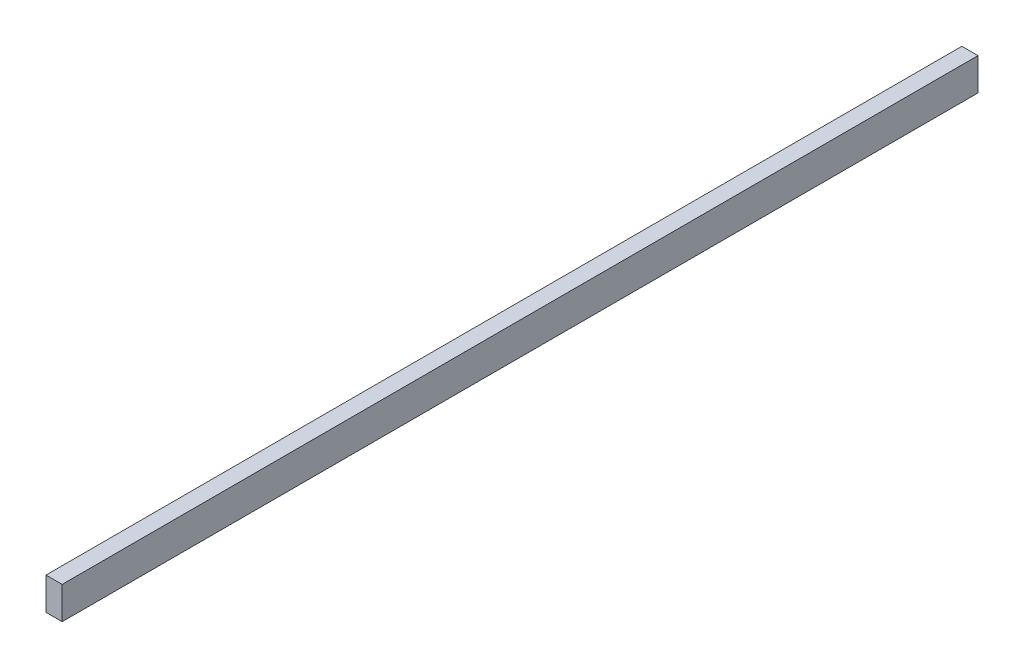
ISO-10303-21;
HEADER;
FILE_DESCRIPTION(('STEP AP214'),'2;1');
FILE_NAME('part.step','',(''),(''),'','','');
FILE_SCHEMA(('AUTOMOTIVE_DESIGN { 1 0 10303 214 1 1 1 1 }'));
ENDSEC;
DATA;
#1=APPLICATION_CONTEXT('core data for automotive mechanical design processes');
#2=APPLICATION_PROTOCOL_DEFINITION('international standard','automotive_design',2000,#1);
#3=PRODUCT_CONTEXT('',#1,'mechanical');
#4=PRODUCT('Part','Part','',(#3));
#5=PRODUCT_RELATED_PRODUCT_CATEGORY('part','',(#4));
#6=PRODUCT_DEFINITION_FORMATION('','',#4);
#7=PRODUCT_DEFINITION_CONTEXT('part definition',#1,'design');
#8=PRODUCT_DEFINITION('design','',#6,#7);
#9=PRODUCT_DEFINITION_SHAPE('','',#8);
#10=(LENGTH_UNIT() NAMED_UNIT(*) SI_UNIT(.MILLI.,.METRE.));
#11=(NAMED_UNIT(*) PLANE_ANGLE_UNIT() SI_UNIT($,.RADIAN.));
#12=(NAMED_UNIT(*) SI_UNIT($,.STERADIAN.) SOLID_ANGLE_UNIT());
#13=UNCERTAINTY_MEASURE_WITH_UNIT(LENGTH_MEASURE(1.E-05),#10,'distance_accuracy_value','');
#14=(GEOMETRIC_REPRESENTATION_CONTEXT(3) GLOBAL_UNCERTAINTY_ASSIGNED_CONTEXT((#13)) GLOBAL_UNIT_ASSIGNED_CONTEXT((#10,
#11,#12)) REPRESENTATION_CONTEXT('',''));
#15=CARTESIAN_POINT('',(0.,0.,0.));
#16=DIRECTION('',(0.,0.,1.));
#17=DIRECTION('',(1.,0.,0.));
#18=AXIS2_PLACEMENT_3D('',#15,#16,#17);
#19=CARTESIAN_POINT('',(0.75000000000001,3.,42.5));
#20=DIRECTION('',(-1.,0.,0.));
#21=DIRECTION('',(0.,0.,1.));
#22=AXIS2_PLACEMENT_3D('',#19,#20,#21);
#23=PLANE('',#22);
#24=DIRECTION('',(0.,0.,-1.));
#25=VECTOR('',#24,1.);
#26=CARTESIAN_POINT('',(0.75000000000001,0.,42.5));
#27=LINE('',#26,#25);
#28=CARTESIAN_POINT('',(0.75000000000001,0.,42.5));
#29=VERTEX_POINT('',#28);
#30=CARTESIAN_POINT('',(0.75000000000001,0.,-42.5));
#31=VERTEX_POINT('',#30);
#32=EDGE_CURVE('E98',#29,#31,#27,.T.);
#33=ORIENTED_EDGE('',*,*,#32,.T.);
#34=DIRECTION('',(0.,-1.,0.));
#35=VECTOR('',#34,1.);
#36=CARTESIAN_POINT('',(0.75000000000001,3.,-42.5));
#37=LINE('',#36,#35);
#38=CARTESIAN_POINT('',(0.75000000000001,3.,-42.5));
#39=VERTEX_POINT('',#38);
#40=EDGE_CURVE('E11',#39,#31,#37,.T.);
#41=ORIENTED_EDGE('',*,*,#40,.F.);
#42=DIRECTION('',(0.,0.,-1.));
#43=VECTOR('',#42,1.);
#44=CARTESIAN_POINT('',(0.75000000000001,3.,42.5));
#45=LINE('',#44,#43);
#46=CARTESIAN_POINT('',(0.75000000000001,3.,42.5));
#47=VERTEX_POINT('',#46);
#48=EDGE_CURVE('E86',#47,#39,#45,.T.);
#49=ORIENTED_EDGE('',*,*,#48,.F.);
#50=DIRECTION('',(0.,-1.,0.));
#51=VECTOR('',#50,1.);
#52=CARTESIAN_POINT('',(0.75000000000001,3.,42.5));
#53=LINE('',#52,#51);
#54=EDGE_CURVE('E94',#47,#29,#53,.T.);
#55=ORIENTED_EDGE('',*,*,#54,.T.);
#56=EDGE_LOOP('',(#33,#41,#49,#55));
#57=FACE_BOUND('',#56,.T.);
#58=ADVANCED_FACE('F35',(#57),#23,.F.);
#59=CARTESIAN_POINT('',(-0.75000000000001,3.,-42.5));
#60=DIRECTION('',(0.,0.,1.));
#61=DIRECTION('',(1.,0.,0.));
#62=AXIS2_PLACEMENT_3D('',#59,#60,#61);
#63=PLANE('',#62);
#64=DIRECTION('',(-1.,0.,0.));
#65=VECTOR('',#64,1.);
#66=CARTESIAN_POINT('',(-0.75000000000001,0.,-42.5));
#67=LINE('',#66,#65);
#68=CARTESIAN_POINT('',(-0.75000000000001,0.,-42.5));
#69=VERTEX_POINT('',#68);
#70=EDGE_CURVE('E90',#31,#69,#67,.T.);
#71=ORIENTED_EDGE('',*,*,#70,.T.);
#72=DIRECTION('',(0.,-1.,0.));
#73=VECTOR('',#72,1.);
#74=CARTESIAN_POINT('',(-0.75000000000001,3.,-42.5));
#75=LINE('',#74,#73);
#76=CARTESIAN_POINT('',(-0.75000000000001,3.,-42.5));
#77=VERTEX_POINT('',#76);
#78=EDGE_CURVE('E43',#77,#69,#75,.T.);
#79=ORIENTED_EDGE('',*,*,#78,.F.);
#80=DIRECTION('',(-1.,0.,0.));
#81=VECTOR('',#80,1.);
#82=CARTESIAN_POINT('',(-0.75000000000001,3.,-42.5));
#83=LINE('',#82,#81);
#84=EDGE_CURVE('E81',#39,#77,#83,.T.);
#85=ORIENTED_EDGE('',*,*,#84,.F.);
#86=ORIENTED_EDGE('',*,*,#40,.T.);
#87=EDGE_LOOP('',(#71,#79,#85,#86));
#88=FACE_BOUND('',#87,.T.);
#89=ADVANCED_FACE('F89',(#88),#63,.F.);
#90=CARTESIAN_POINT('',(-0.74999999999999,3.,42.5));
#91=DIRECTION('',(1.,0.,0.));
#92=DIRECTION('',(0.,0.,-1.));
#93=AXIS2_PLACEMENT_3D('',#90,#91,#92);
#94=PLANE('',#93);
#95=DIRECTION('',(0.,0.,1.));
#96=VECTOR('',#95,1.);
#97=CARTESIAN_POINT('',(-0.74999999999999,0.,42.5));
#98=LINE('',#97,#96);
#99=CARTESIAN_POINT('',(-0.74999999999999,0.,42.5));
#100=VERTEX_POINT('',#99);
#101=EDGE_CURVE('E68',#69,#100,#98,.T.);
#102=ORIENTED_EDGE('',*,*,#101,.T.);
#103=DIRECTION('',(0.,-1.,0.));
#104=VECTOR('',#103,1.);
#105=CARTESIAN_POINT('',(-0.74999999999999,3.,42.5));
#106=LINE('',#105,#104);
#107=CARTESIAN_POINT('',(-0.74999999999999,3.,42.5));
#108=VERTEX_POINT('',#107);
#109=EDGE_CURVE('E91',#108,#100,#106,.T.);
#110=ORIENTED_EDGE('',*,*,#109,.F.);
#111=DIRECTION('',(0.,0.,1.));
#112=VECTOR('',#111,1.);
#113=CARTESIAN_POINT('',(-0.74999999999999,3.,42.5));
#114=LINE('',#113,#112);
#115=EDGE_CURVE('E84',#77,#108,#114,.T.);
#116=ORIENTED_EDGE('',*,*,#115,.F.);
#117=ORIENTED_EDGE('',*,*,#78,.T.);
#118=EDGE_LOOP('',(#102,#110,#116,#117));
#119=FACE_BOUND('',#118,.T.);
#120=ADVANCED_FACE('F92',(#119),#94,.F.);
#121=CARTESIAN_POINT('',(-0.74999999999999,3.,42.5));
#122=DIRECTION('',(0.,0.,-1.));
#123=DIRECTION('',(-1.,0.,0.));
#124=AXIS2_PLACEMENT_3D('',#121,#122,#123);
#125=PLANE('',#124);
#126=DIRECTION('',(1.,0.,0.));
#127=VECTOR('',#126,1.);
#128=CARTESIAN_POINT('',(-0.74999999999999,0.,42.5));
#129=LINE('',#128,#127);
#130=EDGE_CURVE('E74',#100,#29,#129,.T.);
#131=ORIENTED_EDGE('',*,*,#130,.T.);
#132=ORIENTED_EDGE('',*,*,#54,.F.);
#133=DIRECTION('',(1.,0.,0.));
#134=VECTOR('',#133,1.);
#135=CARTESIAN_POINT('',(-0.74999999999999,3.,42.5));
#136=LINE('',#135,#134);
#137=EDGE_CURVE('E51',#108,#47,#136,.T.);
#138=ORIENTED_EDGE('',*,*,#137,.F.);
#139=ORIENTED_EDGE('',*,*,#109,.T.);
#140=EDGE_LOOP('',(#131,#132,#138,#139));
#141=FACE_BOUND('',#140,.T.);
#142=ADVANCED_FACE('F105',(#141),#125,.F.);
#143=CARTESIAN_POINT('',(0.,3.,0.));
#144=DIRECTION('',(0.,-1.,0.));
#145=DIRECTION('',(0.,0.,-1.));
#146=AXIS2_PLACEMENT_3D('',#143,#144,#145);
#147=PLANE('',#146);
#148=ORIENTED_EDGE('',*,*,#48,.T.);
#149=ORIENTED_EDGE('',*,*,#84,.T.);
#150=ORIENTED_EDGE('',*,*,#115,.T.);
#151=ORIENTED_EDGE('',*,*,#137,.T.);
#152=EDGE_LOOP('',(#148,#149,#150,#151));
#153=FACE_BOUND('',#152,.T.);
#154=ADVANCED_FACE('F82',(#153),#147,.F.);
#155=CARTESIAN_POINT('',(0.,0.,0.));
#156=DIRECTION('',(0.,-1.,0.));
#157=DIRECTION('',(0.,0.,-1.));
#158=AXIS2_PLACEMENT_3D('',#155,#156,#157);
#159=PLANE('',#158);
#160=ORIENTED_EDGE('',*,*,#32,.F.);
#161=ORIENTED_EDGE('',*,*,#130,.F.);
#162=ORIENTED_EDGE('',*,*,#101,.F.);
#163=ORIENTED_EDGE('',*,*,#70,.F.);
#164=EDGE_LOOP('',(#160,#161,#162,#163));
#165=FACE_BOUND('',#164,.T.);
#166=ADVANCED_FACE('F108',(#165),#159,.T.);
#167=CLOSED_SHELL('',(#58,#89,#120,#142,#154,#166));
#168=MANIFOLD_SOLID_BREP('B2',#167);
#169=ADVANCED_BREP_SHAPE_REPRESENTATION('',(#18,#168),#14);
#170=SHAPE_DEFINITION_REPRESENTATION(#9,#169);
ENDSEC;
END-ISO-10303-21;
